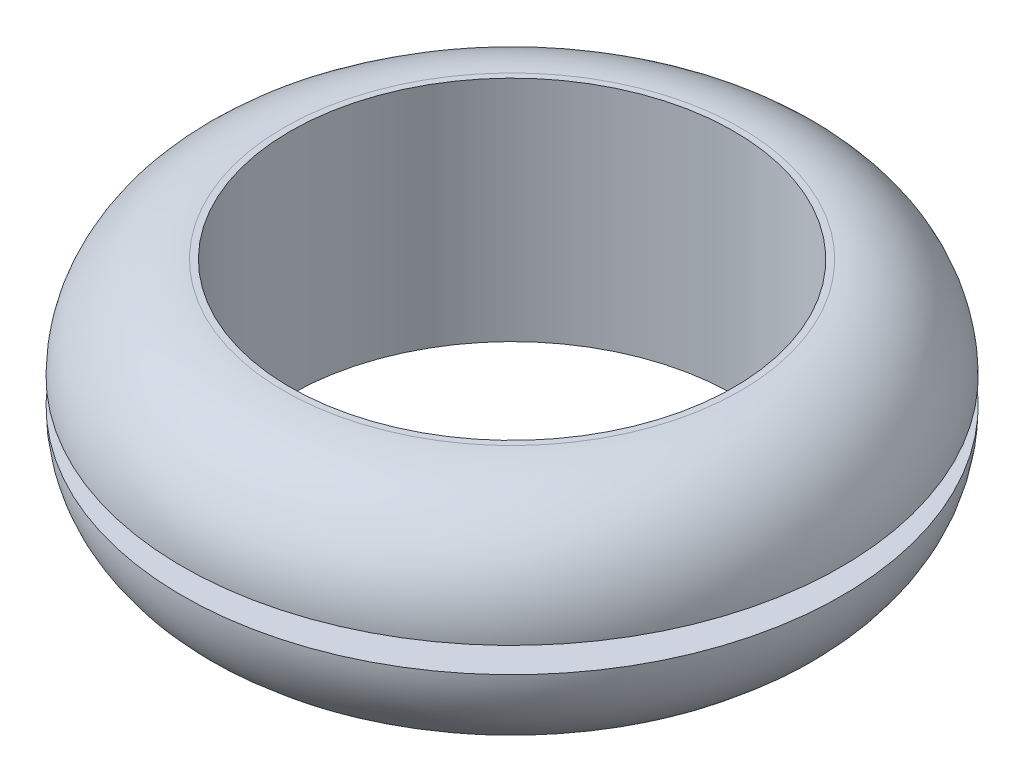
ISO-10303-21;
HEADER;
FILE_DESCRIPTION(('STEP AP214'),'2;1');
FILE_NAME('part.step','',(''),(''),'','','');
FILE_SCHEMA(('AUTOMOTIVE_DESIGN { 1 0 10303 214 1 1 1 1 }'));
ENDSEC;
DATA;
#1=APPLICATION_CONTEXT('core data for automotive mechanical design processes');
#2=APPLICATION_PROTOCOL_DEFINITION('international standard','automotive_design',2000,#1);
#3=PRODUCT_CONTEXT('',#1,'mechanical');
#4=PRODUCT('Part','Part','',(#3));
#5=PRODUCT_RELATED_PRODUCT_CATEGORY('part','',(#4));
#6=PRODUCT_DEFINITION_FORMATION('','',#4);
#7=PRODUCT_DEFINITION_CONTEXT('part definition',#1,'design');
#8=PRODUCT_DEFINITION('design','',#6,#7);
#9=PRODUCT_DEFINITION_SHAPE('','',#8);
#10=(LENGTH_UNIT() NAMED_UNIT(*) SI_UNIT(.MILLI.,.METRE.));
#11=(NAMED_UNIT(*) PLANE_ANGLE_UNIT() SI_UNIT($,.RADIAN.));
#12=(NAMED_UNIT(*) SI_UNIT($,.STERADIAN.) SOLID_ANGLE_UNIT());
#13=UNCERTAINTY_MEASURE_WITH_UNIT(LENGTH_MEASURE(1.E-05),#10,'distance_accuracy_value','');
#14=(GEOMETRIC_REPRESENTATION_CONTEXT(3) GLOBAL_UNCERTAINTY_ASSIGNED_CONTEXT((#13)) GLOBAL_UNIT_ASSIGNED_CONTEXT((#10,
#11,#12)) REPRESENTATION_CONTEXT('',''));
#15=CARTESIAN_POINT('',(0.,0.,0.));
#16=DIRECTION('',(0.,0.,1.));
#17=DIRECTION('',(1.,0.,0.));
#18=AXIS2_PLACEMENT_3D('',#15,#16,#17);
#19=CARTESIAN_POINT('',(0.,4.95,0.));
#20=DIRECTION('',(0.,-1.,0.));
#21=DIRECTION('',(-1.,0.,0.));
#22=AXIS2_PLACEMENT_3D('',#19,#20,#21);
#23=CYLINDRICAL_SURFACE('',#22,9.5);
#24=CARTESIAN_POINT('',(0.,-0.5,0.));
#25=DIRECTION('',(0.,-1.,0.));
#26=DIRECTION('',(-1.,0.,0.));
#27=AXIS2_PLACEMENT_3D('',#24,#25,#26);
#28=CIRCLE('',#27,9.5);
#29=CARTESIAN_POINT('',(-9.5,-0.5,0.));
#30=VERTEX_POINT('',#29);
#31=EDGE_CURVE('E31',#30,#30,#28,.T.);
#32=ORIENTED_EDGE('',*,*,#31,.F.);
#33=EDGE_LOOP('',(#32));
#34=FACE_BOUND('',#33,.T.);
#35=CARTESIAN_POINT('',(0.,0.5,0.));
#36=DIRECTION('',(0.,-1.,0.));
#37=DIRECTION('',(-1.,0.,0.));
#38=AXIS2_PLACEMENT_3D('',#35,#36,#37);
#39=CIRCLE('',#38,9.5);
#40=CARTESIAN_POINT('',(-9.5,0.5,0.));
#41=VERTEX_POINT('',#40);
#42=EDGE_CURVE('E10',#41,#41,#39,.T.);
#43=ORIENTED_EDGE('',*,*,#42,.T.);
#44=EDGE_LOOP('',(#43));
#45=FACE_BOUND('',#44,.T.);
#46=ADVANCED_FACE('F15',(#34,#45),#23,.T.);
#47=CARTESIAN_POINT('',(0.,0.5,0.));
#48=DIRECTION('',(0.,-1.,0.));
#49=DIRECTION('',(-1.,0.,0.));
#50=AXIS2_PLACEMENT_3D('',#47,#48,#49);
#51=PLANE('',#50);
#52=CARTESIAN_POINT('',(0.,0.5,0.));
#53=DIRECTION('',(0.,1.,0.));
#54=DIRECTION('',(-1.,0.,0.));
#55=AXIS2_PLACEMENT_3D('',#52,#53,#54);
#56=CIRCLE('',#55,13.);
#57=CARTESIAN_POINT('',(-13.,0.5,0.));
#58=VERTEX_POINT('',#57);
#59=EDGE_CURVE('E28',#58,#58,#56,.T.);
#60=ORIENTED_EDGE('',*,*,#59,.F.);
#61=EDGE_LOOP('',(#60));
#62=FACE_BOUND('',#61,.T.);
#63=ORIENTED_EDGE('',*,*,#42,.F.);
#64=EDGE_LOOP('',(#63));
#65=FACE_BOUND('',#64,.T.);
#66=ADVANCED_FACE('F55',(#62,#65),#51,.T.);
#67=CARTESIAN_POINT('',(0.,0.5,0.));
#68=DIRECTION('',(0.,-1.,0.));
#69=DIRECTION('',(-1.,0.,0.));
#70=AXIS2_PLACEMENT_3D('',#67,#68,#69);
#71=TOROIDAL_SURFACE('',#70,9.,4.);
#72=ORIENTED_EDGE('',*,*,#59,.T.);
#73=EDGE_LOOP('',(#72));
#74=FACE_BOUND('',#73,.T.);
#75=CARTESIAN_POINT('',(0.,4.5,0.));
#76=DIRECTION('',(0.,-1.,0.));
#77=DIRECTION('',(-1.,0.,0.));
#78=AXIS2_PLACEMENT_3D('',#75,#76,#77);
#79=CIRCLE('',#78,9.);
#80=CARTESIAN_POINT('',(-9.,4.5,0.));
#81=VERTEX_POINT('',#80);
#82=EDGE_CURVE('E23',#81,#81,#79,.T.);
#83=ORIENTED_EDGE('',*,*,#82,.T.);
#84=EDGE_LOOP('',(#83));
#85=FACE_BOUND('',#84,.T.);
#86=ADVANCED_FACE('F61',(#74,#85),#71,.T.);
#87=CARTESIAN_POINT('',(0.,4.5,0.));
#88=DIRECTION('',(0.,-1.,0.));
#89=DIRECTION('',(-1.,0.,0.));
#90=AXIS2_PLACEMENT_3D('',#87,#88,#89);
#91=PLANE('',#90);
#92=ORIENTED_EDGE('',*,*,#82,.F.);
#93=EDGE_LOOP('',(#92));
#94=FACE_BOUND('',#93,.T.);
#95=CARTESIAN_POINT('',(0.,4.5,0.));
#96=DIRECTION('',(0.,1.,0.));
#97=DIRECTION('',(-1.,0.,0.));
#98=AXIS2_PLACEMENT_3D('',#95,#96,#97);
#99=CIRCLE('',#98,8.75);
#100=CARTESIAN_POINT('',(-8.75,4.5,0.));
#101=VERTEX_POINT('',#100);
#102=EDGE_CURVE('E38',#101,#101,#99,.T.);
#103=ORIENTED_EDGE('',*,*,#102,.F.);
#104=EDGE_LOOP('',(#103));
#105=FACE_BOUND('',#104,.T.);
#106=ADVANCED_FACE('F67',(#94,#105),#91,.F.);
#107=CARTESIAN_POINT('',(0.,4.95,0.));
#108=DIRECTION('',(0.,-1.,0.));
#109=DIRECTION('',(-1.,0.,0.));
#110=AXIS2_PLACEMENT_3D('',#107,#108,#109);
#111=CYLINDRICAL_SURFACE('',#110,8.75);
#112=ORIENTED_EDGE('',*,*,#102,.T.);
#113=EDGE_LOOP('',(#112));
#114=FACE_BOUND('',#113,.T.);
#115=CARTESIAN_POINT('',(0.,-4.5,0.));
#116=DIRECTION('',(0.,-1.,0.));
#117=DIRECTION('',(-1.,0.,0.));
#118=AXIS2_PLACEMENT_3D('',#115,#116,#117);
#119=CIRCLE('',#118,8.75);
#120=CARTESIAN_POINT('',(-8.75,-4.5,0.));
#121=VERTEX_POINT('',#120);
#122=EDGE_CURVE('E36',#121,#121,#119,.T.);
#123=ORIENTED_EDGE('',*,*,#122,.T.);
#124=EDGE_LOOP('',(#123));
#125=FACE_BOUND('',#124,.T.);
#126=ADVANCED_FACE('F71',(#114,#125),#111,.F.);
#127=CARTESIAN_POINT('',(0.,-4.5,0.));
#128=DIRECTION('',(0.,-1.,0.));
#129=DIRECTION('',(-1.,0.,0.));
#130=AXIS2_PLACEMENT_3D('',#127,#128,#129);
#131=PLANE('',#130);
#132=CARTESIAN_POINT('',(0.,-4.5,0.));
#133=DIRECTION('',(0.,1.,0.));
#134=DIRECTION('',(-1.,0.,0.));
#135=AXIS2_PLACEMENT_3D('',#132,#133,#134);
#136=CIRCLE('',#135,9.);
#137=CARTESIAN_POINT('',(-9.,-4.5,0.));
#138=VERTEX_POINT('',#137);
#139=EDGE_CURVE('E34',#138,#138,#136,.T.);
#140=ORIENTED_EDGE('',*,*,#139,.F.);
#141=EDGE_LOOP('',(#140));
#142=FACE_BOUND('',#141,.T.);
#143=ORIENTED_EDGE('',*,*,#122,.F.);
#144=EDGE_LOOP('',(#143));
#145=FACE_BOUND('',#144,.T.);
#146=ADVANCED_FACE('F75',(#142,#145),#131,.T.);
#147=CARTESIAN_POINT('',(0.,-0.5,0.));
#148=DIRECTION('',(0.,-1.,0.));
#149=DIRECTION('',(-1.,0.,0.));
#150=AXIS2_PLACEMENT_3D('',#147,#148,#149);
#151=TOROIDAL_SURFACE('',#150,9.,4.);
#152=ORIENTED_EDGE('',*,*,#139,.T.);
#153=EDGE_LOOP('',(#152));
#154=FACE_BOUND('',#153,.T.);
#155=CARTESIAN_POINT('',(0.,-0.5,0.));
#156=DIRECTION('',(0.,-1.,0.));
#157=DIRECTION('',(-1.,0.,0.));
#158=AXIS2_PLACEMENT_3D('',#155,#156,#157);
#159=CIRCLE('',#158,13.);
#160=CARTESIAN_POINT('',(-13.,-0.5,0.));
#161=VERTEX_POINT('',#160);
#162=EDGE_CURVE('E19',#161,#161,#159,.T.);
#163=ORIENTED_EDGE('',*,*,#162,.T.);
#164=EDGE_LOOP('',(#163));
#165=FACE_BOUND('',#164,.T.);
#166=ADVANCED_FACE('F48',(#154,#165),#151,.T.);
#167=CARTESIAN_POINT('',(0.,-0.5,0.));
#168=DIRECTION('',(0.,-1.,0.));
#169=DIRECTION('',(-1.,0.,0.));
#170=AXIS2_PLACEMENT_3D('',#167,#168,#169);
#171=PLANE('',#170);
#172=ORIENTED_EDGE('',*,*,#162,.F.);
#173=EDGE_LOOP('',(#172));
#174=FACE_BOUND('',#173,.T.);
#175=ORIENTED_EDGE('',*,*,#31,.T.);
#176=EDGE_LOOP('',(#175));
#177=FACE_BOUND('',#176,.T.);
#178=ADVANCED_FACE('F17',(#174,#177),#171,.F.);
#179=CLOSED_SHELL('',(#46,#66,#86,#106,#126,#146,#166,#178));
#180=MANIFOLD_SOLID_BREP('B1',#179);
#181=ADVANCED_BREP_SHAPE_REPRESENTATION('',(#18,#180),#14);
#182=SHAPE_DEFINITION_REPRESENTATION(#9,#181);
ENDSEC;
END-ISO-10303-21;
